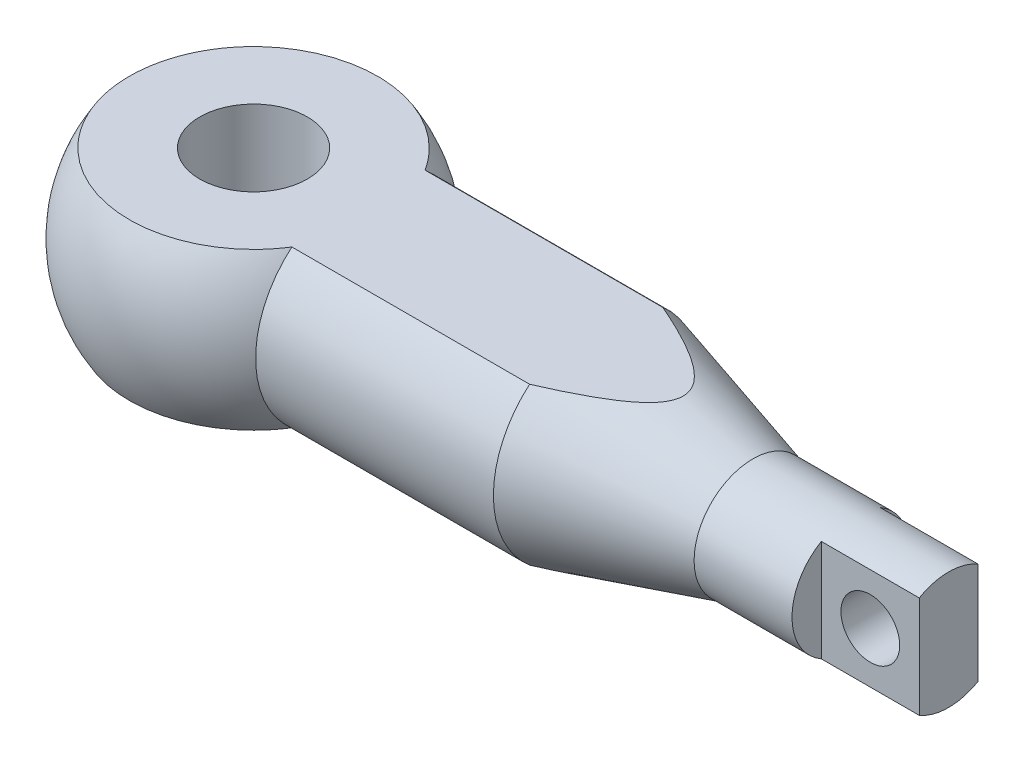
ISO-10303-21;
HEADER;
FILE_DESCRIPTION(('STEP AP214'),'2;1');
FILE_NAME('part.step','',(''),(''),'','','');
FILE_SCHEMA(('AUTOMOTIVE_DESIGN { 1 0 10303 214 1 1 1 1 }'));
ENDSEC;
DATA;
#1=APPLICATION_CONTEXT('core data for automotive mechanical design processes');
#2=APPLICATION_PROTOCOL_DEFINITION('international standard','automotive_design',2000,#1);
#3=PRODUCT_CONTEXT('',#1,'mechanical');
#4=PRODUCT('Part','Part','',(#3));
#5=PRODUCT_RELATED_PRODUCT_CATEGORY('part','',(#4));
#6=PRODUCT_DEFINITION_FORMATION('','',#4);
#7=PRODUCT_DEFINITION_CONTEXT('part definition',#1,'design');
#8=PRODUCT_DEFINITION('design','',#6,#7);
#9=PRODUCT_DEFINITION_SHAPE('','',#8);
#10=(LENGTH_UNIT() NAMED_UNIT(*) SI_UNIT(.MILLI.,.METRE.));
#11=(NAMED_UNIT(*) PLANE_ANGLE_UNIT() SI_UNIT($,.RADIAN.));
#12=(NAMED_UNIT(*) SI_UNIT($,.STERADIAN.) SOLID_ANGLE_UNIT());
#13=UNCERTAINTY_MEASURE_WITH_UNIT(LENGTH_MEASURE(1.E-05),#10,'distance_accuracy_value','');
#14=(GEOMETRIC_REPRESENTATION_CONTEXT(3) GLOBAL_UNCERTAINTY_ASSIGNED_CONTEXT((#13)) GLOBAL_UNIT_ASSIGNED_CONTEXT((#10,
#11,#12)) REPRESENTATION_CONTEXT('',''));
#15=CARTESIAN_POINT('',(0.,0.,0.));
#16=DIRECTION('',(0.,0.,1.));
#17=DIRECTION('',(1.,0.,0.));
#18=AXIS2_PLACEMENT_3D('',#15,#16,#17);
#19=CARTESIAN_POINT('',(3.5,0.,0.));
#20=DIRECTION('',(-1.,0.,0.));
#21=DIRECTION('',(0.,0.,1.));
#22=AXIS2_PLACEMENT_3D('',#19,#20,#21);
#23=CONICAL_SURFACE('',#22,1.05,0.274167451119659);
#24=CARTESIAN_POINT('',(5.1,0.,0.));
#25=DIRECTION('',(-1.,0.,0.));
#26=DIRECTION('',(0.,0.,1.));
#27=AXIS2_PLACEMENT_3D('',#24,#25,#26);
#28=CIRCLE('',#27,0.599999999999999);
#29=CARTESIAN_POINT('',(5.1,0.,0.599999999999999));
#30=VERTEX_POINT('',#29);
#31=EDGE_CURVE('E244',#30,#30,#28,.T.);
#32=ORIENTED_EDGE('',*,*,#31,.T.);
#33=EDGE_LOOP('',(#32));
#34=FACE_BOUND('',#33,.T.);
#35=CARTESIAN_POINT('',(3.5,0.,0.));
#36=DIRECTION('',(-1.,0.,0.));
#37=DIRECTION('',(0.,0.,1.));
#38=AXIS2_PLACEMENT_3D('',#35,#36,#37);
#39=CIRCLE('',#38,1.05);
#40=CARTESIAN_POINT('',(3.5,-0.8,0.680073525436771));
#41=VERTEX_POINT('',#40);
#42=CARTESIAN_POINT('',(3.5,0.8,0.680073525436771));
#43=VERTEX_POINT('',#42);
#44=EDGE_CURVE('E239',#41,#43,#39,.T.);
#45=ORIENTED_EDGE('',*,*,#44,.F.);
#46=CARTESIAN_POINT('',(0.859724243511184,-0.8,1.60416155549005));
#47=CARTESIAN_POINT('',(0.968440225523931,-0.8,1.56998843433007));
#48=CARTESIAN_POINT('',(1.07709745639416,-0.8,1.53562669427273));
#49=CARTESIAN_POINT('',(1.29426365407978,-0.8,1.46641846483471));
#50=CARTESIAN_POINT('',(1.4027726127755,-0.8,1.43157194998996));
#51=CARTESIAN_POINT('',(1.61986408014505,-0.8,1.36120465320704));
#52=CARTESIAN_POINT('',(1.7284461242841,-0.8,1.32568243575858));
#53=CARTESIAN_POINT('',(1.94536001291365,-0.8,1.25389346512559));
#54=CARTESIAN_POINT('',(2.05369186610911,-0.8,1.21762673829272));
#55=CARTESIAN_POINT('',(2.27671635247662,-0.8,1.14186297936773));
#56=CARTESIAN_POINT('',(2.39138827469907,-0.8,1.10230483675663));
#57=CARTESIAN_POINT('',(2.62023452577013,-0.8,1.02172670207985));
#58=CARTESIAN_POINT('',(2.73440879901815,-0.8,0.980706551141195));
#59=CARTESIAN_POINT('',(2.96184902939092,-0.8,0.89665804332281));
#60=CARTESIAN_POINT('',(3.07511597425915,-0.8,0.853632366044185));
#61=CARTESIAN_POINT('',(3.30043942215513,-0.8,0.764536146413736));
#62=CARTESIAN_POINT('',(3.41249621721048,-0.8,0.718466358659038));
#63=CARTESIAN_POINT('',(3.57773061422753,-0.8,0.646059674561078));
#64=CARTESIAN_POINT('',(3.63175393287552,-0.8,0.621659802423025));
#65=CARTESIAN_POINT('',(3.73907252850377,-0.8,0.571168217584876));
#66=CARTESIAN_POINT('',(3.79236712511466,-0.8,0.545075039254047));
#67=CARTESIAN_POINT('',(3.89732057997061,-0.8,0.490749565451163));
#68=CARTESIAN_POINT('',(3.94898909666317,-0.8,0.462535998752591));
#69=CARTESIAN_POINT('',(4.05027826351326,-0.8,0.402681359096414));
#70=CARTESIAN_POINT('',(4.09990223559375,-0.8,0.371046175379372));
#71=CARTESIAN_POINT('',(4.17231265137661,-0.8,0.318495366135057));
#72=CARTESIAN_POINT('',(4.19660216342194,-0.8,0.299671587258962));
#73=CARTESIAN_POINT('',(4.24337352932203,-0.8,0.259835493187297));
#74=CARTESIAN_POINT('',(4.26585590313648,-0.8,0.238823811529955));
#75=CARTESIAN_POINT('',(4.30100718268629,-0.8,0.200938647956276));
#76=CARTESIAN_POINT('',(4.31452719294581,-0.8,0.184865902772189));
#77=CARTESIAN_POINT('',(4.33925674935546,-0.8,0.151006987448137));
#78=CARTESIAN_POINT('',(4.35047069795919,-0.8,0.133224179070795));
#79=CARTESIAN_POINT('',(4.36629213671772,-0.8,0.101815812567888));
#80=CARTESIAN_POINT('',(4.37186510017924,-0.8,0.0886844731830056));
#81=CARTESIAN_POINT('',(4.38083855465726,-0.8,0.0617031780592582));
#82=CARTESIAN_POINT('',(4.38424318335724,-0.8,0.0478546458528131));
#83=CARTESIAN_POINT('',(4.38847608083468,-0.8,0.0196337853151614));
#84=CARTESIAN_POINT('',(4.38928227921822,-0.8,0.00525801345671326));
#85=CARTESIAN_POINT('',(4.388130284882,-0.8,-0.0233881968082086));
#86=CARTESIAN_POINT('',(4.38616986901953,-0.8,-0.0376585412314835));
#87=CARTESIAN_POINT('',(4.37940886248641,-0.8,-0.0671914187812751));
#88=CARTESIAN_POINT('',(4.37431293829176,-0.8,-0.0823843846617884));
#89=CARTESIAN_POINT('',(4.36174664654827,-0.8,-0.111739405695144));
#90=CARTESIAN_POINT('',(4.35427269041526,-0.8,-0.125899862777908));
#91=CARTESIAN_POINT('',(4.33171660812615,-0.8,-0.16283744226132));
#92=CARTESIAN_POINT('',(4.31499931785264,-0.8,-0.184597877830837));
#93=CARTESIAN_POINT('',(4.27875433873371,-0.8,-0.225646531927068));
#94=CARTESIAN_POINT('',(4.25921503817288,-0.8,-0.244923880873715));
#95=CARTESIAN_POINT('',(4.21797178862619,-0.8,-0.282028860886312));
#96=CARTESIAN_POINT('',(4.19622715502933,-0.8,-0.299810618804636));
#97=CARTESIAN_POINT('',(4.15159719830959,-0.8,-0.333893405058583));
#98=CARTESIAN_POINT('',(4.12871088330141,-0.8,-0.350193109836361));
#99=CARTESIAN_POINT('',(4.05877897370652,-0.8,-0.397494754896803));
#100=CARTESIAN_POINT('',(4.01058901274002,-0.8,-0.426792831457089));
#101=CARTESIAN_POINT('',(3.91189649648385,-0.8,-0.482947592209013));
#102=CARTESIAN_POINT('',(3.8613700118919,-0.8,-0.509760743065309));
#103=CARTESIAN_POINT('',(3.75940487529573,-0.8,-0.561309919070635));
#104=CARTESIAN_POINT('',(3.70796832202198,-0.8,-0.586050118530227));
#105=CARTESIAN_POINT('',(3.59673908316462,-0.8,-0.63763965048784));
#106=CARTESIAN_POINT('',(3.53683966012139,-0.8,-0.664256720844383));
#107=CARTESIAN_POINT('',(3.41643660590518,-0.8,-0.716092909236198));
#108=CARTESIAN_POINT('',(3.35593291968765,-0.8,-0.741311898518807));
#109=CARTESIAN_POINT('',(3.17374175724274,-0.8,-0.815415727217622));
#110=CARTESIAN_POINT('',(3.05141681914803,-0.8,-0.862728345399313));
#111=CARTESIAN_POINT('',(2.80550267654206,-0.8,-0.954858102232214));
#112=CARTESIAN_POINT('',(2.68191110283469,-0.8,-0.999668818312545));
#113=CARTESIAN_POINT('',(2.43411821206069,-0.8,-1.0874821482865));
#114=CARTESIAN_POINT('',(2.30991702899393,-0.8,-1.13048514126648));
#115=CARTESIAN_POINT('',(2.07529303527725,-0.8,-1.21036002681196));
#116=CARTESIAN_POINT('',(1.96491735507945,-0.8,-1.24737105060294));
#117=CARTESIAN_POINT('',(1.74389903477997,-0.8,-1.32061065306415));
#118=CARTESIAN_POINT('',(1.63325637781381,-0.8,-1.35683918078633));
#119=CARTESIAN_POINT('',(1.41221696206274,-0.8,-1.42853280282316));
#120=CARTESIAN_POINT('',(1.3018210085436,-0.8,-1.46400038487884));
#121=CARTESIAN_POINT('',(1.08087834772971,-0.8,-1.53443077215623));
#122=CARTESIAN_POINT('',(0.970331653913574,-0.8,-1.56939361963599));
#123=CARTESIAN_POINT('',(0.859724243511186,-0.8,-1.60416155549006));
#124=B_SPLINE_CURVE_WITH_KNOTS('',3,(#46,#47,#48,#49,#50,#51,#52,#53,#54,#55,#56,#57,#58,#59,
#60,#61,#62,#63,#64,#65,#66,#67,#68,#69,#70,#71,#72,#73,#74,#75,#76,#77,#78,#79,#80,#81,#82,#83,
#84,#85,#86,#87,#88,#89,#90,#91,#92,#93,#94,#95,#96,#97,#98,#99,#100,#101,#102,#103,#104,#105,
#106,#107,#108,#109,#110,#111,#112,#113,#114,#115,#116,#117,#118,#119,#120,#121,#122,#123),
.UNSPECIFIED.,.F.,.F.,(4,2,2,2,2,2,2,2,2,2,2,2,2,2,2,2,2,2,2,2,2,2,2,2,2,2,2,2,2,2,2,2,2,2,2,2,
2,2,4),(0.,0.341881721047339,0.683781468655314,1.02651393374898,1.3692342887856,
1.73313777483841,2.09708092671511,2.46055101972545,2.82393134860354,3.00174739338228,
3.1797194532683,3.35627150541371,3.53252437403378,3.62463986749858,3.71672876140411,
3.77961441640699,3.84237887979538,3.88502765401906,3.92759479874279,3.97052255787203,
4.01348483171319,4.06129156277462,4.10917078180606,4.19102854353487,4.27323326445443,
4.35741007364743,4.44166133395193,4.61066202557269,4.78221402076179,4.9534118148841,
5.15002892995052,5.3466641219852,5.74007456565663,6.13445242037591,6.5287471557477,
6.87799091762449,7.22725735051496,7.57511661876364,7.92294659218868),.UNSPECIFIED.);
#125=CARTESIAN_POINT('',(3.5,-0.8,-0.680073525436771));
#126=VERTEX_POINT('',#125);
#127=EDGE_CURVE('E189',#41,#126,#124,.T.);
#128=ORIENTED_EDGE('',*,*,#127,.T.);
#129=CARTESIAN_POINT('',(3.5,0.8,-0.680073525436771));
#130=VERTEX_POINT('',#129);
#131=EDGE_CURVE('E241',#130,#126,#39,.T.);
#132=ORIENTED_EDGE('',*,*,#131,.F.);
#133=CARTESIAN_POINT('',(0.859724243511184,0.8,-1.60416155549005));
#134=CARTESIAN_POINT('',(0.968440225523931,0.8,-1.56998843433007));
#135=CARTESIAN_POINT('',(1.07709745639416,0.8,-1.53562669427273));
#136=CARTESIAN_POINT('',(1.29426365407978,0.8,-1.46641846483471));
#137=CARTESIAN_POINT('',(1.4027726127755,0.8,-1.43157194998996));
#138=CARTESIAN_POINT('',(1.61986408014505,0.8,-1.36120465320704));
#139=CARTESIAN_POINT('',(1.7284461242841,0.8,-1.32568243575858));
#140=CARTESIAN_POINT('',(1.94536001291365,0.8,-1.25389346512559));
#141=CARTESIAN_POINT('',(2.05369186610911,0.8,-1.21762673829272));
#142=CARTESIAN_POINT('',(2.27671635247662,0.8,-1.14186297936773));
#143=CARTESIAN_POINT('',(2.39138827469907,0.8,-1.10230483675663));
#144=CARTESIAN_POINT('',(2.62023452577013,0.8,-1.02172670207985));
#145=CARTESIAN_POINT('',(2.73440879901815,0.8,-0.980706551141195));
#146=CARTESIAN_POINT('',(2.96184902939092,0.8,-0.896658043322809));
#147=CARTESIAN_POINT('',(3.07511597425915,0.8,-0.853632366044184));
#148=CARTESIAN_POINT('',(3.30043942215513,0.8,-0.764536146413736));
#149=CARTESIAN_POINT('',(3.41249621721048,0.8,-0.718466358659038));
#150=CARTESIAN_POINT('',(3.57773061422753,0.8,-0.646059674561078));
#151=CARTESIAN_POINT('',(3.63175393287552,0.8,-0.621659802423024));
#152=CARTESIAN_POINT('',(3.73907252850377,0.8,-0.571168217584876));
#153=CARTESIAN_POINT('',(3.79236712511466,0.8,-0.545075039254047));
#154=CARTESIAN_POINT('',(3.89732057997061,0.8,-0.490749565451163));
#155=CARTESIAN_POINT('',(3.94898909666317,0.8,-0.462535998752591));
#156=CARTESIAN_POINT('',(4.05027826351326,0.8,-0.402681359096414));
#157=CARTESIAN_POINT('',(4.09990223559375,0.8,-0.371046175379372));
#158=CARTESIAN_POINT('',(4.17231265137661,0.8,-0.318495366135057));
#159=CARTESIAN_POINT('',(4.19660216342194,0.8,-0.299671587258962));
#160=CARTESIAN_POINT('',(4.24337352932203,0.8,-0.259835493187297));
#161=CARTESIAN_POINT('',(4.26585590313648,0.8,-0.238823811529955));
#162=CARTESIAN_POINT('',(4.30100718268629,0.8,-0.200938647956276));
#163=CARTESIAN_POINT('',(4.31452719294581,0.8,-0.184865902772189));
#164=CARTESIAN_POINT('',(4.33925674935546,0.8,-0.151006987448137));
#165=CARTESIAN_POINT('',(4.35047069795919,0.8,-0.133224179070795));
#166=CARTESIAN_POINT('',(4.36629213671772,0.8,-0.101815812567888));
#167=CARTESIAN_POINT('',(4.37186510017924,0.8,-0.0886844731830056));
#168=CARTESIAN_POINT('',(4.38083855465726,0.8,-0.0617031780592582));
#169=CARTESIAN_POINT('',(4.38424318335724,0.8,-0.0478546458528131));
#170=CARTESIAN_POINT('',(4.38847608083468,0.8,-0.0196337853151614));
#171=CARTESIAN_POINT('',(4.38928227921822,0.8,-0.00525801345671326));
#172=CARTESIAN_POINT('',(4.388130284882,0.8,0.0233881968082086));
#173=CARTESIAN_POINT('',(4.38616986901953,0.8,0.0376585412314835));
#174=CARTESIAN_POINT('',(4.37940886248641,0.8,0.0671914187812751));
#175=CARTESIAN_POINT('',(4.37431293829176,0.8,0.0823843846617884));
#176=CARTESIAN_POINT('',(4.36174664654827,0.8,0.111739405695144));
#177=CARTESIAN_POINT('',(4.35427269041526,0.8,0.125899862777908));
#178=CARTESIAN_POINT('',(4.33171660812615,0.8,0.16283744226132));
#179=CARTESIAN_POINT('',(4.31499931785264,0.8,0.184597877830837));
#180=CARTESIAN_POINT('',(4.27875433873371,0.8,0.225646531927068));
#181=CARTESIAN_POINT('',(4.25921503817288,0.8,0.244923880873715));
#182=CARTESIAN_POINT('',(4.21797178862619,0.8,0.282028860886312));
#183=CARTESIAN_POINT('',(4.19622715502933,0.8,0.299810618804636));
#184=CARTESIAN_POINT('',(4.15159719830959,0.8,0.333893405058583));
#185=CARTESIAN_POINT('',(4.12871088330141,0.8,0.350193109836361));
#186=CARTESIAN_POINT('',(4.05877897370652,0.8,0.397494754896803));
#187=CARTESIAN_POINT('',(4.01058901274002,0.8,0.426792831457089));
#188=CARTESIAN_POINT('',(3.91189649648385,0.8,0.482947592209013));
#189=CARTESIAN_POINT('',(3.8613700118919,0.8,0.509760743065309));
#190=CARTESIAN_POINT('',(3.75940487529573,0.8,0.561309919070635));
#191=CARTESIAN_POINT('',(3.70796832202198,0.8,0.586050118530227));
#192=CARTESIAN_POINT('',(3.59673908316462,0.8,0.63763965048784));
#193=CARTESIAN_POINT('',(3.53683966012139,0.8,0.664256720844383));
#194=CARTESIAN_POINT('',(3.41643660590518,0.8,0.716092909236198));
#195=CARTESIAN_POINT('',(3.35593291968765,0.8,0.741311898518807));
#196=CARTESIAN_POINT('',(3.17374175724274,0.8,0.815415727217622));
#197=CARTESIAN_POINT('',(3.05141681914803,0.8,0.862728345399313));
#198=CARTESIAN_POINT('',(2.80550267654206,0.8,0.954858102232214));
#199=CARTESIAN_POINT('',(2.68191110283469,0.8,0.999668818312545));
#200=CARTESIAN_POINT('',(2.43411821206069,0.8,1.0874821482865));
#201=CARTESIAN_POINT('',(2.30991702899393,0.8,1.13048514126648));
#202=CARTESIAN_POINT('',(2.07529303527725,0.8,1.21036002681196));
#203=CARTESIAN_POINT('',(1.96491735507945,0.8,1.24737105060294));
#204=CARTESIAN_POINT('',(1.74389903477997,0.8,1.32061065306415));
#205=CARTESIAN_POINT('',(1.63325637781381,0.8,1.35683918078633));
#206=CARTESIAN_POINT('',(1.41221696206274,0.8,1.42853280282316));
#207=CARTESIAN_POINT('',(1.3018210085436,0.8,1.46400038487884));
#208=CARTESIAN_POINT('',(1.08087834772971,0.8,1.53443077215623));
#209=CARTESIAN_POINT('',(0.970331653913574,0.8,1.56939361963599));
#210=CARTESIAN_POINT('',(0.859724243511186,0.8,1.60416155549006));
#211=B_SPLINE_CURVE_WITH_KNOTS('',3,(#133,#134,#135,#136,#137,#138,#139,#140,#141,#142,#143,
#144,#145,#146,#147,#148,#149,#150,#151,#152,#153,#154,#155,#156,#157,#158,#159,#160,#161,#162,
#163,#164,#165,#166,#167,#168,#169,#170,#171,#172,#173,#174,#175,#176,#177,#178,#179,#180,#181,
#182,#183,#184,#185,#186,#187,#188,#189,#190,#191,#192,#193,#194,#195,#196,#197,#198,#199,#200,
#201,#202,#203,#204,#205,#206,#207,#208,#209,#210),.UNSPECIFIED.,.F.,.F.,(4,2,2,2,2,2,2,2,2,2,2,
2,2,2,2,2,2,2,2,2,2,2,2,2,2,2,2,2,2,2,2,2,2,2,2,2,2,2,4),(0.,0.341881721047339,
0.683781468655313,1.02651393374898,1.3692342887856,1.73313777483841,2.09708092671511,
2.46055101972545,2.82393134860354,3.00174739338228,3.1797194532683,3.35627150541371,
3.53252437403378,3.62463986749858,3.71672876140411,3.77961441640699,3.84237887979538,
3.88502765401906,3.92759479874279,3.97052255787203,4.01348483171319,4.06129156277462,
4.10917078180606,4.19102854353487,4.27323326445443,4.35741007364743,4.44166133395193,
4.61066202557269,4.78221402076179,4.9534118148841,5.15002892995052,5.3466641219852,
5.74007456565663,6.13445242037591,6.5287471557477,6.87799091762449,7.22725735051496,
7.57511661876364,7.92294659218868),.UNSPECIFIED.);
#212=EDGE_CURVE('E180',#130,#43,#211,.T.);
#213=ORIENTED_EDGE('',*,*,#212,.T.);
#214=EDGE_LOOP('',(#45,#128,#132,#213));
#215=FACE_BOUND('',#214,.T.);
#216=ADVANCED_FACE('F49',(#34,#215),#23,.T.);
#217=CARTESIAN_POINT('',(7.1,0.,0.));
#218=DIRECTION('',(-1.,0.,0.));
#219=DIRECTION('',(0.,0.,1.));
#220=AXIS2_PLACEMENT_3D('',#217,#218,#219);
#221=CYLINDRICAL_SURFACE('',#220,1.05);
#222=CARTESIAN_POINT('',(1.07121426428143,0.,0.));
#223=DIRECTION('',(-1.,0.,0.));
#224=DIRECTION('',(0.,0.,1.));
#225=AXIS2_PLACEMENT_3D('',#222,#223,#224);
#226=CIRCLE('',#225,1.05);
#227=CARTESIAN_POINT('',(1.07121426428143,-0.8,0.680073525436771));
#228=VERTEX_POINT('',#227);
#229=CARTESIAN_POINT('',(1.07121426428143,0.8,0.680073525436771));
#230=VERTEX_POINT('',#229);
#231=EDGE_CURVE('E199',#228,#230,#226,.T.);
#232=ORIENTED_EDGE('',*,*,#231,.F.);
#233=DIRECTION('',(-1.,0.,0.));
#234=VECTOR('',#233,1.);
#235=CARTESIAN_POINT('',(7.1,-0.8,0.680073525436771));
#236=LINE('',#235,#234);
#237=EDGE_CURVE('E200',#228,#41,#236,.F.);
#238=ORIENTED_EDGE('',*,*,#237,.T.);
#239=ORIENTED_EDGE('',*,*,#44,.T.);
#240=DIRECTION('',(-1.,0.,0.));
#241=VECTOR('',#240,1.);
#242=CARTESIAN_POINT('',(7.1,0.8,0.680073525436771));
#243=LINE('',#242,#241);
#244=EDGE_CURVE('E236',#43,#230,#243,.T.);
#245=ORIENTED_EDGE('',*,*,#244,.T.);
#246=EDGE_LOOP('',(#232,#238,#239,#245));
#247=FACE_BOUND('',#246,.T.);
#248=ADVANCED_FACE('F165',(#247),#221,.T.);
#249=ORIENTED_EDGE('',*,*,#131,.T.);
#250=DIRECTION('',(-1.,0.,0.));
#251=VECTOR('',#250,1.);
#252=CARTESIAN_POINT('',(7.1,-0.8,-0.680073525436771));
#253=LINE('',#252,#251);
#254=CARTESIAN_POINT('',(1.07121426428143,-0.8,-0.680073525436771));
#255=VERTEX_POINT('',#254);
#256=EDGE_CURVE('E257',#126,#255,#253,.T.);
#257=ORIENTED_EDGE('',*,*,#256,.T.);
#258=CARTESIAN_POINT('',(1.07121426428143,0.8,-0.680073525436771));
#259=VERTEX_POINT('',#258);
#260=EDGE_CURVE('E226',#259,#255,#226,.T.);
#261=ORIENTED_EDGE('',*,*,#260,.F.);
#262=DIRECTION('',(-1.,0.,0.));
#263=VECTOR('',#262,1.);
#264=CARTESIAN_POINT('',(7.1,0.8,-0.680073525436771));
#265=LINE('',#264,#263);
#266=EDGE_CURVE('E255',#259,#130,#265,.F.);
#267=ORIENTED_EDGE('',*,*,#266,.T.);
#268=EDGE_LOOP('',(#249,#257,#261,#267));
#269=FACE_BOUND('',#268,.T.);
#270=ADVANCED_FACE('F171',(#269),#221,.T.);
#271=CARTESIAN_POINT('',(0.,0.,0.));
#272=DIRECTION('',(-1.,0.,0.));
#273=DIRECTION('',(0.,0.,-1.));
#274=AXIS2_PLACEMENT_3D('',#271,#272,#273);
#275=SPHERICAL_SURFACE('',#274,1.5);
#276=CARTESIAN_POINT('',(0.,-0.8,0.));
#277=DIRECTION('',(0.,-1.,0.));
#278=DIRECTION('',(0.,0.,-1.));
#279=AXIS2_PLACEMENT_3D('',#276,#277,#278);
#280=CIRCLE('',#279,1.26885775404495);
#281=EDGE_CURVE('E120',#228,#255,#280,.T.);
#282=ORIENTED_EDGE('',*,*,#281,.F.);
#283=ORIENTED_EDGE('',*,*,#231,.T.);
#284=CARTESIAN_POINT('',(0.,0.8,0.));
#285=DIRECTION('',(0.,1.,0.));
#286=DIRECTION('',(0.,0.,1.));
#287=AXIS2_PLACEMENT_3D('',#284,#285,#286);
#288=CIRCLE('',#287,1.26885775404495);
#289=EDGE_CURVE('E230',#259,#230,#288,.T.);
#290=ORIENTED_EDGE('',*,*,#289,.F.);
#291=ORIENTED_EDGE('',*,*,#260,.T.);
#292=EDGE_LOOP('',(#282,#283,#290,#291));
#293=FACE_BOUND('',#292,.T.);
#294=ADVANCED_FACE('F211',(#293),#275,.T.);
#295=CARTESIAN_POINT('',(7.1,0.,0.));
#296=DIRECTION('',(1.,0.,0.));
#297=DIRECTION('',(0.,0.,-1.));
#298=AXIS2_PLACEMENT_3D('',#295,#296,#297);
#299=PLANE('',#298);
#300=DIRECTION('',(0.,-1.,0.));
#301=VECTOR('',#300,1.);
#302=CARTESIAN_POINT('',(7.1,0.,-0.3));
#303=LINE('',#302,#301);
#304=CARTESIAN_POINT('',(7.1,0.519615242270663,-0.3));
#305=VERTEX_POINT('',#304);
#306=CARTESIAN_POINT('',(7.1,-0.519615242270663,-0.3));
#307=VERTEX_POINT('',#306);
#308=EDGE_CURVE('E273',#305,#307,#303,.T.);
#309=ORIENTED_EDGE('',*,*,#308,.F.);
#310=CARTESIAN_POINT('',(7.1,0.,0.));
#311=DIRECTION('',(-1.,0.,0.));
#312=DIRECTION('',(0.,0.,1.));
#313=AXIS2_PLACEMENT_3D('',#310,#311,#312);
#314=CIRCLE('',#313,0.6);
#315=CARTESIAN_POINT('',(7.1,0.519615242270663,0.3));
#316=VERTEX_POINT('',#315);
#317=EDGE_CURVE('E135',#316,#305,#314,.T.);
#318=ORIENTED_EDGE('',*,*,#317,.F.);
#319=DIRECTION('',(0.,1.,0.));
#320=VECTOR('',#319,1.);
#321=CARTESIAN_POINT('',(7.1,0.,0.3));
#322=LINE('',#321,#320);
#323=CARTESIAN_POINT('',(7.1,-0.519615242270663,0.3));
#324=VERTEX_POINT('',#323);
#325=EDGE_CURVE('E147',#324,#316,#322,.T.);
#326=ORIENTED_EDGE('',*,*,#325,.F.);
#327=EDGE_CURVE('E248',#307,#324,#314,.T.);
#328=ORIENTED_EDGE('',*,*,#327,.F.);
#329=EDGE_LOOP('',(#309,#318,#326,#328));
#330=FACE_BOUND('',#329,.T.);
#331=ADVANCED_FACE('F51',(#330),#299,.T.);
#332=CARTESIAN_POINT('',(7.1,0.,0.));
#333=DIRECTION('',(-1.,0.,0.));
#334=DIRECTION('',(0.,0.,1.));
#335=AXIS2_PLACEMENT_3D('',#332,#333,#334);
#336=CYLINDRICAL_SURFACE('',#335,0.6);
#337=DIRECTION('',(-1.,0.,0.));
#338=VECTOR('',#337,1.);
#339=CARTESIAN_POINT('',(7.1,-0.519615242270663,0.3));
#340=LINE('',#339,#338);
#341=CARTESIAN_POINT('',(6.1,-0.519615242270663,0.3));
#342=VERTEX_POINT('',#341);
#343=EDGE_CURVE('E12',#342,#324,#340,.F.);
#344=ORIENTED_EDGE('',*,*,#343,.F.);
#345=CARTESIAN_POINT('',(6.1,0.,0.));
#346=DIRECTION('',(1.,0.,0.));
#347=DIRECTION('',(0.,0.,-1.));
#348=AXIS2_PLACEMENT_3D('',#345,#346,#347);
#349=CIRCLE('',#348,0.6);
#350=CARTESIAN_POINT('',(6.1,0.519615242270663,0.3));
#351=VERTEX_POINT('',#350);
#352=EDGE_CURVE('E122',#342,#351,#349,.F.);
#353=ORIENTED_EDGE('',*,*,#352,.T.);
#354=DIRECTION('',(-1.,0.,0.));
#355=VECTOR('',#354,1.);
#356=CARTESIAN_POINT('',(7.1,0.519615242270663,0.3));
#357=LINE('',#356,#355);
#358=EDGE_CURVE('E59',#316,#351,#357,.T.);
#359=ORIENTED_EDGE('',*,*,#358,.F.);
#360=ORIENTED_EDGE('',*,*,#317,.T.);
#361=DIRECTION('',(-1.,0.,0.));
#362=VECTOR('',#361,1.);
#363=CARTESIAN_POINT('',(7.1,0.519615242270663,-0.3));
#364=LINE('',#363,#362);
#365=CARTESIAN_POINT('',(6.1,0.519615242270663,-0.3));
#366=VERTEX_POINT('',#365);
#367=EDGE_CURVE('E125',#366,#305,#364,.F.);
#368=ORIENTED_EDGE('',*,*,#367,.F.);
#369=CARTESIAN_POINT('',(6.1,-0.519615242270663,-0.3));
#370=VERTEX_POINT('',#369);
#371=EDGE_CURVE('E113',#366,#370,#349,.F.);
#372=ORIENTED_EDGE('',*,*,#371,.T.);
#373=DIRECTION('',(-1.,0.,0.));
#374=VECTOR('',#373,1.);
#375=CARTESIAN_POINT('',(7.1,-0.519615242270663,-0.3));
#376=LINE('',#375,#374);
#377=EDGE_CURVE('E119',#307,#370,#376,.T.);
#378=ORIENTED_EDGE('',*,*,#377,.F.);
#379=ORIENTED_EDGE('',*,*,#327,.T.);
#380=EDGE_LOOP('',(#344,#353,#359,#360,#368,#372,#378,#379));
#381=FACE_BOUND('',#380,.T.);
#382=ORIENTED_EDGE('',*,*,#31,.F.);
#383=EDGE_LOOP('',(#382));
#384=FACE_BOUND('',#383,.T.);
#385=ADVANCED_FACE('F131',(#381,#384),#336,.T.);
#386=CARTESIAN_POINT('',(-12.8648858981099,0.8,-1.5));
#387=DIRECTION('',(0.,1.,0.));
#388=DIRECTION('',(0.,0.,1.));
#389=AXIS2_PLACEMENT_3D('',#386,#387,#388);
#390=PLANE('',#389);
#391=CARTESIAN_POINT('',(0.,0.8,0.));
#392=DIRECTION('',(0.,1.,0.));
#393=DIRECTION('',(0.,0.,1.));
#394=AXIS2_PLACEMENT_3D('',#391,#392,#393);
#395=CIRCLE('',#394,0.55);
#396=CARTESIAN_POINT('',(0.,0.8,0.55));
#397=VERTEX_POINT('',#396);
#398=EDGE_CURVE('E263',#397,#397,#395,.T.);
#399=ORIENTED_EDGE('',*,*,#398,.F.);
#400=EDGE_LOOP('',(#399));
#401=FACE_BOUND('',#400,.T.);
#402=ORIENTED_EDGE('',*,*,#266,.F.);
#403=ORIENTED_EDGE('',*,*,#289,.T.);
#404=ORIENTED_EDGE('',*,*,#244,.F.);
#405=ORIENTED_EDGE('',*,*,#212,.F.);
#406=EDGE_LOOP('',(#402,#403,#404,#405));
#407=FACE_BOUND('',#406,.T.);
#408=ADVANCED_FACE('F206',(#401,#407),#390,.T.);
#409=CARTESIAN_POINT('',(-12.8648858981099,-0.8,-1.5));
#410=DIRECTION('',(0.,-1.,0.));
#411=DIRECTION('',(0.,0.,-1.));
#412=AXIS2_PLACEMENT_3D('',#409,#410,#411);
#413=PLANE('',#412);
#414=CARTESIAN_POINT('',(0.,-0.8,0.));
#415=DIRECTION('',(0.,1.,0.));
#416=DIRECTION('',(0.,0.,1.));
#417=AXIS2_PLACEMENT_3D('',#414,#415,#416);
#418=CIRCLE('',#417,0.55);
#419=CARTESIAN_POINT('',(0.,-0.8,0.55));
#420=VERTEX_POINT('',#419);
#421=EDGE_CURVE('E269',#420,#420,#418,.T.);
#422=ORIENTED_EDGE('',*,*,#421,.T.);
#423=EDGE_LOOP('',(#422));
#424=FACE_BOUND('',#423,.T.);
#425=ORIENTED_EDGE('',*,*,#237,.F.);
#426=ORIENTED_EDGE('',*,*,#281,.T.);
#427=ORIENTED_EDGE('',*,*,#256,.F.);
#428=ORIENTED_EDGE('',*,*,#127,.F.);
#429=EDGE_LOOP('',(#425,#426,#427,#428));
#430=FACE_BOUND('',#429,.T.);
#431=ADVANCED_FACE('F202',(#424,#430),#413,.T.);
#432=CARTESIAN_POINT('',(0.,-0.8,0.));
#433=DIRECTION('',(0.,1.,0.));
#434=DIRECTION('',(0.,0.,1.));
#435=AXIS2_PLACEMENT_3D('',#432,#433,#434);
#436=CYLINDRICAL_SURFACE('',#435,0.55);
#437=ORIENTED_EDGE('',*,*,#398,.T.);
#438=EDGE_LOOP('',(#437));
#439=FACE_BOUND('',#438,.T.);
#440=ORIENTED_EDGE('',*,*,#421,.F.);
#441=EDGE_LOOP('',(#440));
#442=FACE_BOUND('',#441,.T.);
#443=ADVANCED_FACE('F163',(#439,#442),#436,.F.);
#444=CARTESIAN_POINT('',(6.1,0.,0.));
#445=DIRECTION('',(1.,0.,0.));
#446=DIRECTION('',(0.,0.,-1.));
#447=AXIS2_PLACEMENT_3D('',#444,#445,#446);
#448=PLANE('',#447);
#449=DIRECTION('',(0.,1.,0.));
#450=VECTOR('',#449,1.);
#451=CARTESIAN_POINT('',(6.1,-1.67583320120552,-0.3));
#452=LINE('',#451,#450);
#453=EDGE_CURVE('E72',#370,#366,#452,.T.);
#454=ORIENTED_EDGE('',*,*,#453,.F.);
#455=ORIENTED_EDGE('',*,*,#371,.F.);
#456=EDGE_LOOP('',(#454,#455));
#457=FACE_BOUND('',#456,.T.);
#458=ADVANCED_FACE('F114',(#457),#448,.T.);
#459=CARTESIAN_POINT('',(7.100012,-1.67583320120552,-0.3));
#460=DIRECTION('',(0.,0.,1.));
#461=DIRECTION('',(1.,0.,0.));
#462=AXIS2_PLACEMENT_3D('',#459,#460,#461);
#463=PLANE('',#462);
#464=CARTESIAN_POINT('',(6.6,0.,-0.3));
#465=DIRECTION('',(0.,0.,-1.));
#466=DIRECTION('',(-1.,0.,0.));
#467=AXIS2_PLACEMENT_3D('',#464,#465,#466);
#468=CIRCLE('',#467,0.3);
#469=CARTESIAN_POINT('',(6.3,0.,-0.3));
#470=VERTEX_POINT('',#469);
#471=EDGE_CURVE('E280',#470,#470,#468,.T.);
#472=ORIENTED_EDGE('',*,*,#471,.F.);
#473=EDGE_LOOP('',(#472));
#474=FACE_BOUND('',#473,.T.);
#475=ORIENTED_EDGE('',*,*,#367,.T.);
#476=ORIENTED_EDGE('',*,*,#308,.T.);
#477=ORIENTED_EDGE('',*,*,#377,.T.);
#478=ORIENTED_EDGE('',*,*,#453,.T.);
#479=EDGE_LOOP('',(#475,#476,#477,#478));
#480=FACE_BOUND('',#479,.T.);
#481=ADVANCED_FACE('F124',(#474,#480),#463,.F.);
#482=DIRECTION('',(0.,-1.,0.));
#483=VECTOR('',#482,1.);
#484=CARTESIAN_POINT('',(6.1,-1.67583320120552,0.3));
#485=LINE('',#484,#483);
#486=EDGE_CURVE('E65',#351,#342,#485,.T.);
#487=ORIENTED_EDGE('',*,*,#486,.F.);
#488=ORIENTED_EDGE('',*,*,#352,.F.);
#489=EDGE_LOOP('',(#487,#488));
#490=FACE_BOUND('',#489,.T.);
#491=ADVANCED_FACE('F149',(#490),#448,.T.);
#492=CARTESIAN_POINT('',(7.100012,-1.67583320120552,0.3));
#493=DIRECTION('',(0.,0.,-1.));
#494=DIRECTION('',(0.,1.,0.));
#495=AXIS2_PLACEMENT_3D('',#492,#493,#494);
#496=PLANE('',#495);
#497=CARTESIAN_POINT('',(6.6,0.,0.3));
#498=DIRECTION('',(0.,0.,-1.));
#499=DIRECTION('',(0.,1.,0.));
#500=AXIS2_PLACEMENT_3D('',#497,#498,#499);
#501=CIRCLE('',#500,0.3);
#502=CARTESIAN_POINT('',(6.6,0.3,0.3));
#503=VERTEX_POINT('',#502);
#504=EDGE_CURVE('E53',#503,#503,#501,.T.);
#505=ORIENTED_EDGE('',*,*,#504,.T.);
#506=EDGE_LOOP('',(#505));
#507=FACE_BOUND('',#506,.T.);
#508=ORIENTED_EDGE('',*,*,#343,.T.);
#509=ORIENTED_EDGE('',*,*,#325,.T.);
#510=ORIENTED_EDGE('',*,*,#358,.T.);
#511=ORIENTED_EDGE('',*,*,#486,.T.);
#512=EDGE_LOOP('',(#508,#509,#510,#511));
#513=FACE_BOUND('',#512,.T.);
#514=ADVANCED_FACE('F145',(#507,#513),#496,.F.);
#515=CARTESIAN_POINT('',(6.6,0.,1.5));
#516=DIRECTION('',(0.,0.,-1.));
#517=DIRECTION('',(-1.,0.,0.));
#518=AXIS2_PLACEMENT_3D('',#515,#516,#517);
#519=CYLINDRICAL_SURFACE('',#518,0.3);
#520=ORIENTED_EDGE('',*,*,#471,.T.);
#521=EDGE_LOOP('',(#520));
#522=FACE_BOUND('',#521,.T.);
#523=ORIENTED_EDGE('',*,*,#504,.F.);
#524=EDGE_LOOP('',(#523));
#525=FACE_BOUND('',#524,.T.);
#526=ADVANCED_FACE('F157',(#522,#525),#519,.F.);
#527=CLOSED_SHELL('',(#216,#248,#270,#294,#331,#385,#408,#431,#443,#458,#481,#491,#514,#526));
#528=MANIFOLD_SOLID_BREP('B2',#527);
#529=ADVANCED_BREP_SHAPE_REPRESENTATION('',(#18,#528),#14);
#530=SHAPE_DEFINITION_REPRESENTATION(#9,#529);
ENDSEC;
END-ISO-10303-21;
